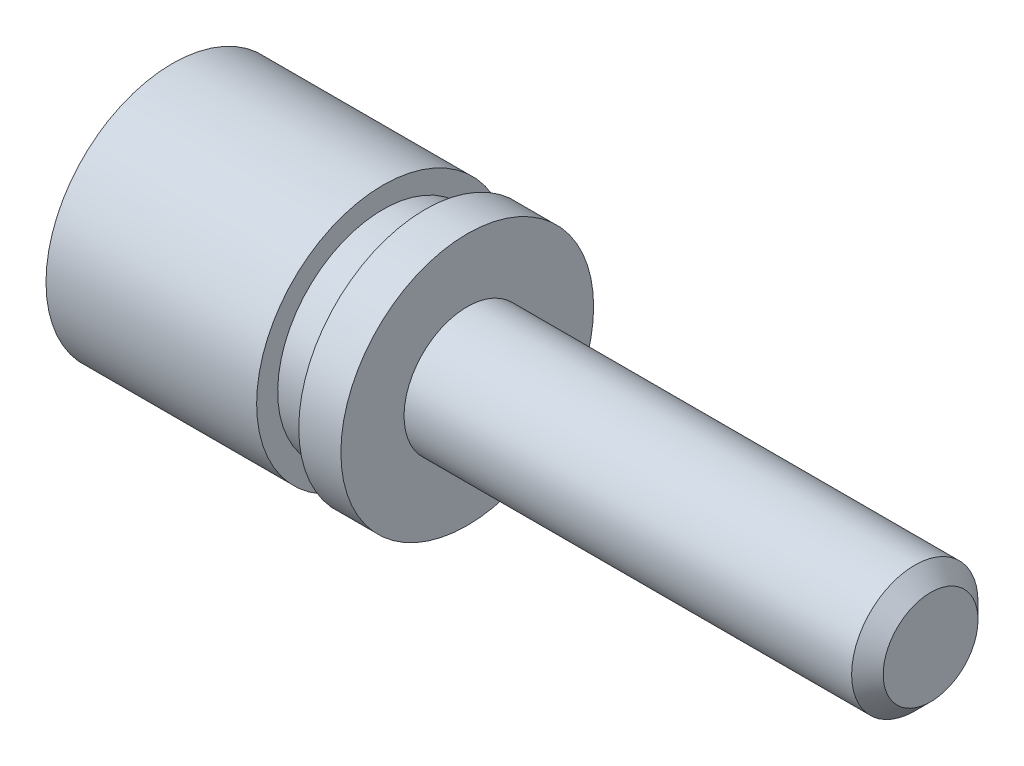
ISO-10303-21;
HEADER;
FILE_DESCRIPTION(('STEP AP214'),'2;1');
FILE_NAME('part.step','',(''),(''),'','','');
FILE_SCHEMA(('AUTOMOTIVE_DESIGN { 1 0 10303 214 1 1 1 1 }'));
ENDSEC;
DATA;
#1=APPLICATION_CONTEXT('core data for automotive mechanical design processes');
#2=APPLICATION_PROTOCOL_DEFINITION('international standard','automotive_design',2000,#1);
#3=PRODUCT_CONTEXT('',#1,'mechanical');
#4=PRODUCT('Part','Part','',(#3));
#5=PRODUCT_RELATED_PRODUCT_CATEGORY('part','',(#4));
#6=PRODUCT_DEFINITION_FORMATION('','',#4);
#7=PRODUCT_DEFINITION_CONTEXT('part definition',#1,'design');
#8=PRODUCT_DEFINITION('design','',#6,#7);
#9=PRODUCT_DEFINITION_SHAPE('','',#8);
#10=(LENGTH_UNIT() NAMED_UNIT(*) SI_UNIT(.MILLI.,.METRE.));
#11=(NAMED_UNIT(*) PLANE_ANGLE_UNIT() SI_UNIT($,.RADIAN.));
#12=(NAMED_UNIT(*) SI_UNIT($,.STERADIAN.) SOLID_ANGLE_UNIT());
#13=UNCERTAINTY_MEASURE_WITH_UNIT(LENGTH_MEASURE(1.E-05),#10,'distance_accuracy_value','');
#14=(GEOMETRIC_REPRESENTATION_CONTEXT(3) GLOBAL_UNCERTAINTY_ASSIGNED_CONTEXT((#13)) GLOBAL_UNIT_ASSIGNED_CONTEXT((#10,
#11,#12)) REPRESENTATION_CONTEXT('',''));
#15=CARTESIAN_POINT('',(0.,0.,0.));
#16=DIRECTION('',(0.,0.,1.));
#17=DIRECTION('',(1.,0.,0.));
#18=AXIS2_PLACEMENT_3D('',#15,#16,#17);
#19=CARTESIAN_POINT('',(10.,0.,0.));
#20=DIRECTION('',(0.,0.,1.));
#21=DIRECTION('',(1.,0.,0.));
#22=AXIS2_PLACEMENT_3D('',#19,#20,#21);
#23=SPHERICAL_SURFACE('',#22,11.6619037896906);
#24=CARTESIAN_POINT('',(10.,0.,0.));
#25=DIRECTION('',(-1.,0.,0.));
#26=DIRECTION('',(0.,-1.,0.));
#27=AXIS2_PLACEMENT_3D('',#24,#25,#26);
#28=SPHERICAL_SURFACE('',#27,11.6619037896906);
#29=CARTESIAN_POINT('',(0.,0.,0.));
#30=DIRECTION('',(-1.,0.,0.));
#31=DIRECTION('',(0.,-1.,0.));
#32=AXIS2_PLACEMENT_3D('',#29,#30,#31);
#33=CIRCLE('',#32,6.);
#34=CARTESIAN_POINT('',(0.,-6.,0.));
#35=VERTEX_POINT('',#34);
#36=EDGE_CURVE('E58',#35,#35,#33,.T.);
#37=ORIENTED_EDGE('',*,*,#36,.T.);
#38=EDGE_LOOP('',(#37));
#39=FACE_BOUND('',#38,.T.);
#40=ADVANCED_FACE('F27',(#39),#28,.T.);
#41=CARTESIAN_POINT('',(36.,3.,0.));
#42=DIRECTION('',(1.,0.,0.));
#43=DIRECTION('',(0.,1.,0.));
#44=AXIS2_PLACEMENT_3D('',#41,#42,#43);
#45=PLANE('',#44);
#46=CARTESIAN_POINT('',(36.,0.,0.));
#47=DIRECTION('',(1.,0.,0.));
#48=DIRECTION('',(0.,1.,0.));
#49=AXIS2_PLACEMENT_3D('',#46,#47,#48);
#50=CIRCLE('',#49,2.24999999999999);
#51=CARTESIAN_POINT('',(36.,2.24999999999999,0.));
#52=VERTEX_POINT('',#51);
#53=EDGE_CURVE('E10',#52,#52,#50,.T.);
#54=ORIENTED_EDGE('',*,*,#53,.T.);
#55=EDGE_LOOP('',(#54));
#56=FACE_BOUND('',#55,.T.);
#57=ADVANCED_FACE('F79',(#56),#45,.T.);
#58=CARTESIAN_POINT('',(-3.,0.,0.));
#59=DIRECTION('',(-1.,0.,0.));
#60=DIRECTION('',(0.,-1.,0.));
#61=AXIS2_PLACEMENT_3D('',#58,#59,#60);
#62=CYLINDRICAL_SURFACE('',#61,3.);
#63=CARTESIAN_POINT('',(35.25,0.,0.));
#64=DIRECTION('',(1.,0.,0.));
#65=DIRECTION('',(0.,1.,0.));
#66=AXIS2_PLACEMENT_3D('',#63,#64,#65);
#67=CIRCLE('',#66,3.);
#68=CARTESIAN_POINT('',(35.25,3.,0.));
#69=VERTEX_POINT('',#68);
#70=EDGE_CURVE('E33',#69,#69,#67,.F.);
#71=ORIENTED_EDGE('',*,*,#70,.T.);
#72=EDGE_LOOP('',(#71));
#73=FACE_BOUND('',#72,.T.);
#74=CARTESIAN_POINT('',(14.,0.,0.));
#75=DIRECTION('',(-1.,0.,0.));
#76=DIRECTION('',(0.,-1.,0.));
#77=AXIS2_PLACEMENT_3D('',#74,#75,#76);
#78=CIRCLE('',#77,3.);
#79=CARTESIAN_POINT('',(14.,-3.,0.));
#80=VERTEX_POINT('',#79);
#81=EDGE_CURVE('E37',#80,#80,#78,.T.);
#82=ORIENTED_EDGE('',*,*,#81,.F.);
#83=EDGE_LOOP('',(#82));
#84=FACE_BOUND('',#83,.T.);
#85=ADVANCED_FACE('F83',(#73,#84),#62,.T.);
#86=CARTESIAN_POINT('',(14.,6.,0.));
#87=DIRECTION('',(1.,0.,0.));
#88=DIRECTION('',(0.,1.,0.));
#89=AXIS2_PLACEMENT_3D('',#86,#87,#88);
#90=PLANE('',#89);
#91=ORIENTED_EDGE('',*,*,#81,.T.);
#92=EDGE_LOOP('',(#91));
#93=FACE_BOUND('',#92,.T.);
#94=CARTESIAN_POINT('',(14.,0.,0.));
#95=DIRECTION('',(-1.,0.,0.));
#96=DIRECTION('',(0.,-1.,0.));
#97=AXIS2_PLACEMENT_3D('',#94,#95,#96);
#98=CIRCLE('',#97,6.);
#99=CARTESIAN_POINT('',(14.,-6.,0.));
#100=VERTEX_POINT('',#99);
#101=EDGE_CURVE('E41',#100,#100,#98,.T.);
#102=ORIENTED_EDGE('',*,*,#101,.F.);
#103=EDGE_LOOP('',(#102));
#104=FACE_BOUND('',#103,.T.);
#105=ADVANCED_FACE('F87',(#93,#104),#90,.T.);
#106=CARTESIAN_POINT('',(-3.,0.,0.));
#107=DIRECTION('',(-1.,0.,0.));
#108=DIRECTION('',(0.,-1.,0.));
#109=AXIS2_PLACEMENT_3D('',#106,#107,#108);
#110=CYLINDRICAL_SURFACE('',#109,6.);
#111=ORIENTED_EDGE('',*,*,#101,.T.);
#112=EDGE_LOOP('',(#111));
#113=FACE_BOUND('',#112,.T.);
#114=CARTESIAN_POINT('',(12.,0.,0.));
#115=DIRECTION('',(-1.,0.,0.));
#116=DIRECTION('',(0.,-1.,0.));
#117=AXIS2_PLACEMENT_3D('',#114,#115,#116);
#118=CIRCLE('',#117,6.);
#119=CARTESIAN_POINT('',(12.,-6.,0.));
#120=VERTEX_POINT('',#119);
#121=EDGE_CURVE('E46',#120,#120,#118,.T.);
#122=ORIENTED_EDGE('',*,*,#121,.F.);
#123=EDGE_LOOP('',(#122));
#124=FACE_BOUND('',#123,.T.);
#125=ADVANCED_FACE('F92',(#113,#124),#110,.T.);
#126=CARTESIAN_POINT('',(12.,6.,0.));
#127=DIRECTION('',(1.,0.,0.));
#128=DIRECTION('',(0.,1.,0.));
#129=AXIS2_PLACEMENT_3D('',#126,#127,#128);
#130=PLANE('',#129);
#131=CARTESIAN_POINT('',(12.,0.,0.));
#132=DIRECTION('',(-1.,0.,0.));
#133=DIRECTION('',(0.,-1.,0.));
#134=AXIS2_PLACEMENT_3D('',#131,#132,#133);
#135=CIRCLE('',#134,5.);
#136=CARTESIAN_POINT('',(12.,-5.,0.));
#137=VERTEX_POINT('',#136);
#138=EDGE_CURVE('E49',#137,#137,#135,.T.);
#139=ORIENTED_EDGE('',*,*,#138,.F.);
#140=EDGE_LOOP('',(#139));
#141=FACE_BOUND('',#140,.T.);
#142=ORIENTED_EDGE('',*,*,#121,.T.);
#143=EDGE_LOOP('',(#142));
#144=FACE_BOUND('',#143,.T.);
#145=ADVANCED_FACE('F96',(#141,#144),#130,.F.);
#146=CARTESIAN_POINT('',(-3.,0.,0.));
#147=DIRECTION('',(-1.,0.,0.));
#148=DIRECTION('',(0.,-1.,0.));
#149=AXIS2_PLACEMENT_3D('',#146,#147,#148);
#150=CYLINDRICAL_SURFACE('',#149,5.);
#151=ORIENTED_EDGE('',*,*,#138,.T.);
#152=EDGE_LOOP('',(#151));
#153=FACE_BOUND('',#152,.T.);
#154=CARTESIAN_POINT('',(10.,0.,0.));
#155=DIRECTION('',(-1.,0.,0.));
#156=DIRECTION('',(0.,-1.,0.));
#157=AXIS2_PLACEMENT_3D('',#154,#155,#156);
#158=CIRCLE('',#157,5.);
#159=CARTESIAN_POINT('',(10.,-5.,0.));
#160=VERTEX_POINT('',#159);
#161=EDGE_CURVE('E52',#160,#160,#158,.T.);
#162=ORIENTED_EDGE('',*,*,#161,.F.);
#163=EDGE_LOOP('',(#162));
#164=FACE_BOUND('',#163,.T.);
#165=ADVANCED_FACE('F75',(#153,#164),#150,.T.);
#166=CARTESIAN_POINT('',(10.,6.,0.));
#167=DIRECTION('',(1.,0.,0.));
#168=DIRECTION('',(0.,1.,0.));
#169=AXIS2_PLACEMENT_3D('',#166,#167,#168);
#170=PLANE('',#169);
#171=ORIENTED_EDGE('',*,*,#161,.T.);
#172=EDGE_LOOP('',(#171));
#173=FACE_BOUND('',#172,.T.);
#174=CARTESIAN_POINT('',(10.,0.,0.));
#175=DIRECTION('',(-1.,0.,0.));
#176=DIRECTION('',(0.,-1.,0.));
#177=AXIS2_PLACEMENT_3D('',#174,#175,#176);
#178=CIRCLE('',#177,6.);
#179=CARTESIAN_POINT('',(10.,-6.,0.));
#180=VERTEX_POINT('',#179);
#181=EDGE_CURVE('E55',#180,#180,#178,.T.);
#182=ORIENTED_EDGE('',*,*,#181,.F.);
#183=EDGE_LOOP('',(#182));
#184=FACE_BOUND('',#183,.T.);
#185=ADVANCED_FACE('F66',(#173,#184),#170,.T.);
#186=CARTESIAN_POINT('',(-3.,0.,0.));
#187=DIRECTION('',(-1.,0.,0.));
#188=DIRECTION('',(0.,-1.,0.));
#189=AXIS2_PLACEMENT_3D('',#186,#187,#188);
#190=CYLINDRICAL_SURFACE('',#189,6.);
#191=ORIENTED_EDGE('',*,*,#181,.T.);
#192=EDGE_LOOP('',(#191));
#193=FACE_BOUND('',#192,.T.);
#194=ORIENTED_EDGE('',*,*,#36,.F.);
#195=EDGE_LOOP('',(#194));
#196=FACE_BOUND('',#195,.T.);
#197=ADVANCED_FACE('F63',(#193,#196),#190,.T.);
#198=CARTESIAN_POINT('',(35.25,0.,0.));
#199=DIRECTION('',(-1.,0.,0.));
#200=DIRECTION('',(0.,-1.,0.));
#201=AXIS2_PLACEMENT_3D('',#198,#199,#200);
#202=CONICAL_SURFACE('',#201,3.,0.785398163397442);
#203=ORIENTED_EDGE('',*,*,#53,.F.);
#204=EDGE_LOOP('',(#203));
#205=FACE_BOUND('',#204,.T.);
#206=ORIENTED_EDGE('',*,*,#70,.F.);
#207=EDGE_LOOP('',(#206));
#208=FACE_BOUND('',#207,.T.);
#209=ADVANCED_FACE('F65',(#205,#208),#202,.T.);
#210=CLOSED_SHELL('',(#40,#57,#85,#105,#125,#145,#165,#185,#197,#209));
#211=MANIFOLD_SOLID_BREP('B2',#210);
#212=ADVANCED_BREP_SHAPE_REPRESENTATION('',(#18,#211),#14);
#213=SHAPE_DEFINITION_REPRESENTATION(#9,#212);
ENDSEC;
END-ISO-10303-21;
